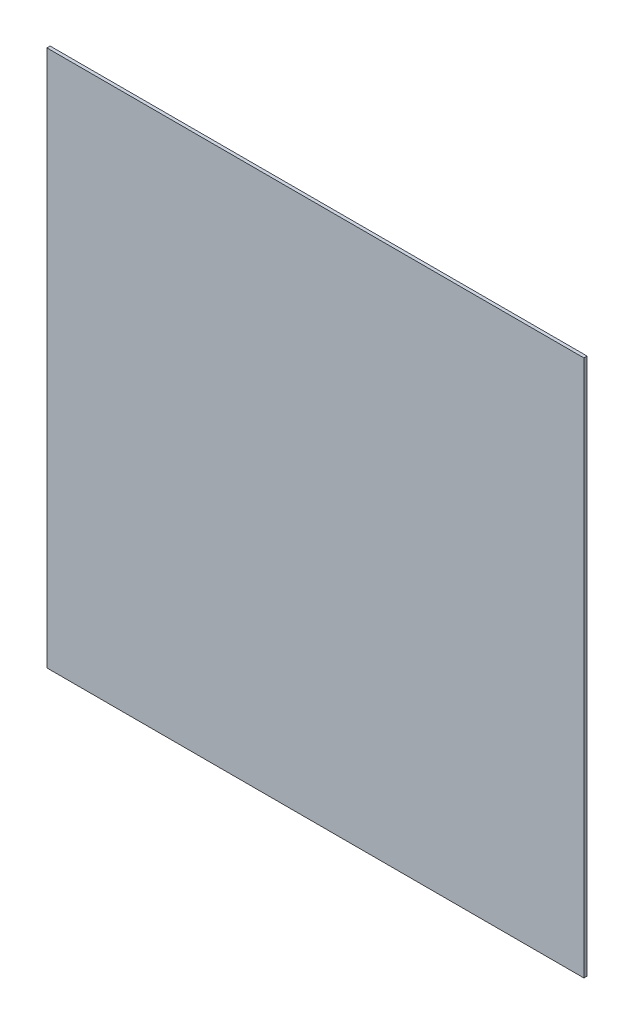
ISO-10303-21;
HEADER;
FILE_DESCRIPTION(('STEP AP214'),'2;1');
FILE_NAME('part.step','',(''),(''),'','','');
FILE_SCHEMA(('AUTOMOTIVE_DESIGN { 1 0 10303 214 1 1 1 1 }'));
ENDSEC;
DATA;
#1=APPLICATION_CONTEXT('core data for automotive mechanical design processes');
#2=APPLICATION_PROTOCOL_DEFINITION('international standard','automotive_design',2000,#1);
#3=PRODUCT_CONTEXT('',#1,'mechanical');
#4=PRODUCT('Part','Part','',(#3));
#5=PRODUCT_RELATED_PRODUCT_CATEGORY('part','',(#4));
#6=PRODUCT_DEFINITION_FORMATION('','',#4);
#7=PRODUCT_DEFINITION_CONTEXT('part definition',#1,'design');
#8=PRODUCT_DEFINITION('design','',#6,#7);
#9=PRODUCT_DEFINITION_SHAPE('','',#8);
#10=(LENGTH_UNIT() NAMED_UNIT(*) SI_UNIT(.MILLI.,.METRE.));
#11=(NAMED_UNIT(*) PLANE_ANGLE_UNIT() SI_UNIT($,.RADIAN.));
#12=(NAMED_UNIT(*) SI_UNIT($,.STERADIAN.) SOLID_ANGLE_UNIT());
#13=UNCERTAINTY_MEASURE_WITH_UNIT(LENGTH_MEASURE(1.E-05),#10,'distance_accuracy_value','');
#14=(GEOMETRIC_REPRESENTATION_CONTEXT(3) GLOBAL_UNCERTAINTY_ASSIGNED_CONTEXT((#13)) GLOBAL_UNIT_ASSIGNED_CONTEXT((#10,
#11,#12)) REPRESENTATION_CONTEXT('',''));
#15=CARTESIAN_POINT('',(0.,0.,0.));
#16=DIRECTION('',(0.,0.,1.));
#17=DIRECTION('',(1.,0.,0.));
#18=AXIS2_PLACEMENT_3D('',#15,#16,#17);
#19=CARTESIAN_POINT('',(15.,-15.,0.18));
#20=DIRECTION('',(-1.,0.,0.));
#21=DIRECTION('',(0.,0.,1.));
#22=AXIS2_PLACEMENT_3D('',#19,#20,#21);
#23=PLANE('',#22);
#24=DIRECTION('',(0.,1.,0.));
#25=VECTOR('',#24,1.);
#26=CARTESIAN_POINT('',(15.,-15.,0.));
#27=LINE('',#26,#25);
#28=CARTESIAN_POINT('',(15.,-15.,0.));
#29=VERTEX_POINT('',#28);
#30=CARTESIAN_POINT('',(15.,15.,0.));
#31=VERTEX_POINT('',#30);
#32=EDGE_CURVE('E95',#29,#31,#27,.T.);
#33=ORIENTED_EDGE('',*,*,#32,.T.);
#34=DIRECTION('',(0.,0.,-1.));
#35=VECTOR('',#34,1.);
#36=CARTESIAN_POINT('',(15.,15.,0.18));
#37=LINE('',#36,#35);
#38=CARTESIAN_POINT('',(15.,15.,0.18));
#39=VERTEX_POINT('',#38);
#40=EDGE_CURVE('E11',#39,#31,#37,.T.);
#41=ORIENTED_EDGE('',*,*,#40,.F.);
#42=DIRECTION('',(0.,1.,0.));
#43=VECTOR('',#42,1.);
#44=CARTESIAN_POINT('',(15.,-15.,0.18));
#45=LINE('',#44,#43);
#46=CARTESIAN_POINT('',(15.,-15.,0.18));
#47=VERTEX_POINT('',#46);
#48=EDGE_CURVE('E83',#47,#39,#45,.T.);
#49=ORIENTED_EDGE('',*,*,#48,.F.);
#50=DIRECTION('',(0.,0.,-1.));
#51=VECTOR('',#50,1.);
#52=CARTESIAN_POINT('',(15.,-15.,0.18));
#53=LINE('',#52,#51);
#54=EDGE_CURVE('E91',#47,#29,#53,.T.);
#55=ORIENTED_EDGE('',*,*,#54,.T.);
#56=EDGE_LOOP('',(#33,#41,#49,#55));
#57=FACE_BOUND('',#56,.T.);
#58=ADVANCED_FACE('F32',(#57),#23,.F.);
#59=CARTESIAN_POINT('',(-15.,15.,0.18));
#60=DIRECTION('',(0.,-1.,0.));
#61=DIRECTION('',(0.,0.,-1.));
#62=AXIS2_PLACEMENT_3D('',#59,#60,#61);
#63=PLANE('',#62);
#64=DIRECTION('',(-1.,0.,0.));
#65=VECTOR('',#64,1.);
#66=CARTESIAN_POINT('',(-15.,15.,0.));
#67=LINE('',#66,#65);
#68=CARTESIAN_POINT('',(-15.,15.,0.));
#69=VERTEX_POINT('',#68);
#70=EDGE_CURVE('E87',#31,#69,#67,.T.);
#71=ORIENTED_EDGE('',*,*,#70,.T.);
#72=DIRECTION('',(0.,0.,-1.));
#73=VECTOR('',#72,1.);
#74=CARTESIAN_POINT('',(-15.,15.,0.18));
#75=LINE('',#74,#73);
#76=CARTESIAN_POINT('',(-15.,15.,0.18));
#77=VERTEX_POINT('',#76);
#78=EDGE_CURVE('E40',#77,#69,#75,.T.);
#79=ORIENTED_EDGE('',*,*,#78,.F.);
#80=DIRECTION('',(-1.,0.,0.));
#81=VECTOR('',#80,1.);
#82=CARTESIAN_POINT('',(-15.,15.,0.18));
#83=LINE('',#82,#81);
#84=EDGE_CURVE('E78',#39,#77,#83,.T.);
#85=ORIENTED_EDGE('',*,*,#84,.F.);
#86=ORIENTED_EDGE('',*,*,#40,.T.);
#87=EDGE_LOOP('',(#71,#79,#85,#86));
#88=FACE_BOUND('',#87,.T.);
#89=ADVANCED_FACE('F86',(#88),#63,.F.);
#90=CARTESIAN_POINT('',(-15.,-15.,0.18));
#91=DIRECTION('',(1.,0.,0.));
#92=DIRECTION('',(0.,0.,-1.));
#93=AXIS2_PLACEMENT_3D('',#90,#91,#92);
#94=PLANE('',#93);
#95=DIRECTION('',(0.,-1.,0.));
#96=VECTOR('',#95,1.);
#97=CARTESIAN_POINT('',(-15.,-15.,0.));
#98=LINE('',#97,#96);
#99=CARTESIAN_POINT('',(-15.,-15.,0.));
#100=VERTEX_POINT('',#99);
#101=EDGE_CURVE('E65',#69,#100,#98,.T.);
#102=ORIENTED_EDGE('',*,*,#101,.T.);
#103=DIRECTION('',(0.,0.,-1.));
#104=VECTOR('',#103,1.);
#105=CARTESIAN_POINT('',(-15.,-15.,0.18));
#106=LINE('',#105,#104);
#107=CARTESIAN_POINT('',(-15.,-15.,0.18));
#108=VERTEX_POINT('',#107);
#109=EDGE_CURVE('E88',#108,#100,#106,.T.);
#110=ORIENTED_EDGE('',*,*,#109,.F.);
#111=DIRECTION('',(0.,-1.,0.));
#112=VECTOR('',#111,1.);
#113=CARTESIAN_POINT('',(-15.,-15.,0.18));
#114=LINE('',#113,#112);
#115=EDGE_CURVE('E81',#77,#108,#114,.T.);
#116=ORIENTED_EDGE('',*,*,#115,.F.);
#117=ORIENTED_EDGE('',*,*,#78,.T.);
#118=EDGE_LOOP('',(#102,#110,#116,#117));
#119=FACE_BOUND('',#118,.T.);
#120=ADVANCED_FACE('F89',(#119),#94,.F.);
#121=CARTESIAN_POINT('',(-15.,-15.,0.18));
#122=DIRECTION('',(0.,1.,0.));
#123=DIRECTION('',(0.,0.,1.));
#124=AXIS2_PLACEMENT_3D('',#121,#122,#123);
#125=PLANE('',#124);
#126=DIRECTION('',(1.,0.,0.));
#127=VECTOR('',#126,1.);
#128=CARTESIAN_POINT('',(-15.,-15.,0.));
#129=LINE('',#128,#127);
#130=EDGE_CURVE('E71',#100,#29,#129,.T.);
#131=ORIENTED_EDGE('',*,*,#130,.T.);
#132=ORIENTED_EDGE('',*,*,#54,.F.);
#133=DIRECTION('',(1.,0.,0.));
#134=VECTOR('',#133,1.);
#135=CARTESIAN_POINT('',(-15.,-15.,0.18));
#136=LINE('',#135,#134);
#137=EDGE_CURVE('E48',#108,#47,#136,.T.);
#138=ORIENTED_EDGE('',*,*,#137,.F.);
#139=ORIENTED_EDGE('',*,*,#109,.T.);
#140=EDGE_LOOP('',(#131,#132,#138,#139));
#141=FACE_BOUND('',#140,.T.);
#142=ADVANCED_FACE('F102',(#141),#125,.F.);
#143=CARTESIAN_POINT('',(0.,0.,0.18));
#144=DIRECTION('',(0.,0.,-1.));
#145=DIRECTION('',(-1.,0.,0.));
#146=AXIS2_PLACEMENT_3D('',#143,#144,#145);
#147=PLANE('',#146);
#148=ORIENTED_EDGE('',*,*,#48,.T.);
#149=ORIENTED_EDGE('',*,*,#84,.T.);
#150=ORIENTED_EDGE('',*,*,#115,.T.);
#151=ORIENTED_EDGE('',*,*,#137,.T.);
#152=EDGE_LOOP('',(#148,#149,#150,#151));
#153=FACE_BOUND('',#152,.T.);
#154=ADVANCED_FACE('F79',(#153),#147,.F.);
#155=CARTESIAN_POINT('',(0.,0.,0.));
#156=DIRECTION('',(0.,0.,-1.));
#157=DIRECTION('',(-1.,0.,0.));
#158=AXIS2_PLACEMENT_3D('',#155,#156,#157);
#159=PLANE('',#158);
#160=ORIENTED_EDGE('',*,*,#32,.F.);
#161=ORIENTED_EDGE('',*,*,#130,.F.);
#162=ORIENTED_EDGE('',*,*,#101,.F.);
#163=ORIENTED_EDGE('',*,*,#70,.F.);
#164=EDGE_LOOP('',(#160,#161,#162,#163));
#165=FACE_BOUND('',#164,.T.);
#166=ADVANCED_FACE('F105',(#165),#159,.T.);
#167=CLOSED_SHELL('',(#58,#89,#120,#142,#154,#166));
#168=MANIFOLD_SOLID_BREP('B2',#167);
#169=ADVANCED_BREP_SHAPE_REPRESENTATION('',(#18,#168),#14);
#170=SHAPE_DEFINITION_REPRESENTATION(#9,#169);
ENDSEC;
END-ISO-10303-21;
